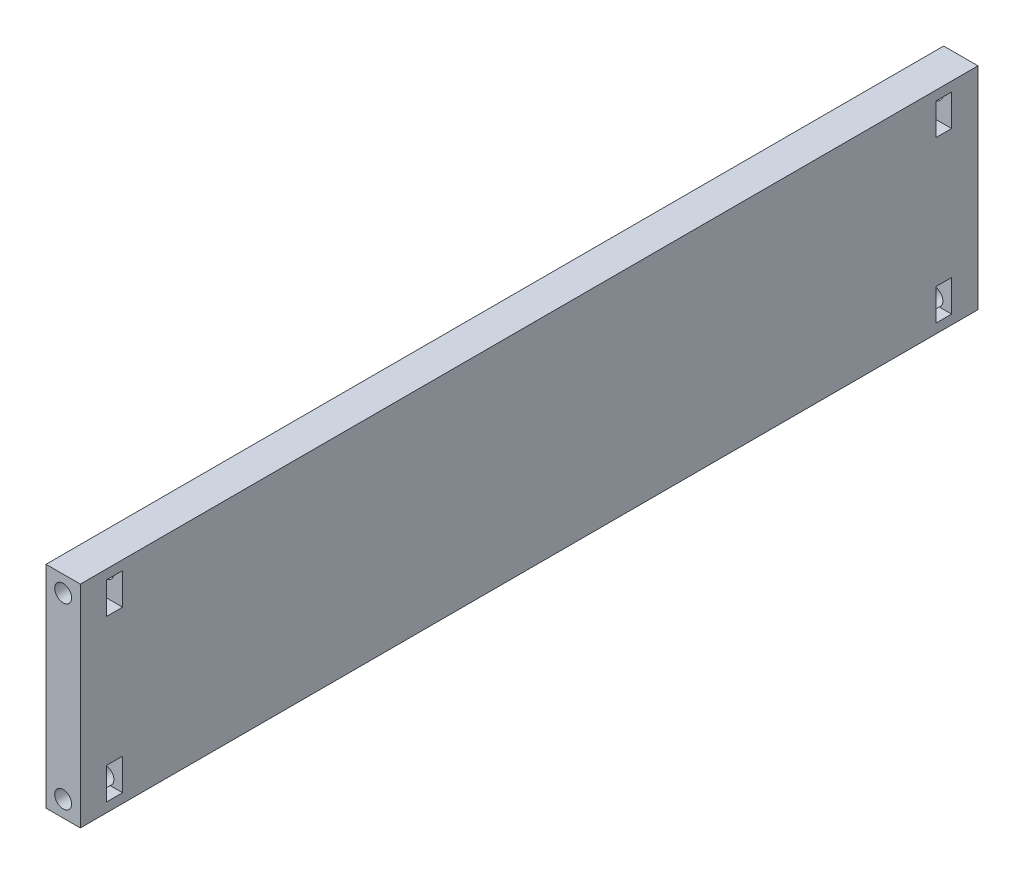
ISO-10303-21;
HEADER;
FILE_DESCRIPTION(('STEP AP214'),'2;1');
FILE_NAME('part.step','',(''),(''),'','','');
FILE_SCHEMA(('AUTOMOTIVE_DESIGN { 1 0 10303 214 1 1 1 1 }'));
ENDSEC;
DATA;
#1=APPLICATION_CONTEXT('core data for automotive mechanical design processes');
#2=APPLICATION_PROTOCOL_DEFINITION('international standard','automotive_design',2000,#1);
#3=PRODUCT_CONTEXT('',#1,'mechanical');
#4=PRODUCT('Part','Part','',(#3));
#5=PRODUCT_RELATED_PRODUCT_CATEGORY('part','',(#4));
#6=PRODUCT_DEFINITION_FORMATION('','',#4);
#7=PRODUCT_DEFINITION_CONTEXT('part definition',#1,'design');
#8=PRODUCT_DEFINITION('design','',#6,#7);
#9=PRODUCT_DEFINITION_SHAPE('','',#8);
#10=(LENGTH_UNIT() NAMED_UNIT(*) SI_UNIT(.MILLI.,.METRE.));
#11=(NAMED_UNIT(*) PLANE_ANGLE_UNIT() SI_UNIT($,.RADIAN.));
#12=(NAMED_UNIT(*) SI_UNIT($,.STERADIAN.) SOLID_ANGLE_UNIT());
#13=UNCERTAINTY_MEASURE_WITH_UNIT(LENGTH_MEASURE(1.E-05),#10,'distance_accuracy_value','');
#14=(GEOMETRIC_REPRESENTATION_CONTEXT(3) GLOBAL_UNCERTAINTY_ASSIGNED_CONTEXT((#13)) GLOBAL_UNIT_ASSIGNED_CONTEXT((#10,
#11,#12)) REPRESENTATION_CONTEXT('',''));
#15=CARTESIAN_POINT('',(0.,0.,0.));
#16=DIRECTION('',(0.,0.,1.));
#17=DIRECTION('',(1.,0.,0.));
#18=AXIS2_PLACEMENT_3D('',#15,#16,#17);
#19=CARTESIAN_POINT('',(6.5,1.78605941041524,-165.));
#20=DIRECTION('',(0.,1.,0.));
#21=DIRECTION('',(0.,0.,1.));
#22=AXIS2_PLACEMENT_3D('',#19,#20,#21);
#23=PLANE('',#22);
#24=DIRECTION('',(0.,0.,-1.));
#25=VECTOR('',#24,1.);
#26=CARTESIAN_POINT('',(4.16299514075464,1.78605941041524,-145.));
#27=LINE('',#26,#25);
#28=CARTESIAN_POINT('',(4.16299514075464,1.78605941041524,-162.));
#29=VERTEX_POINT('',#28);
#30=CARTESIAN_POINT('',(4.16299514075464,1.78605941041524,-165.));
#31=VERTEX_POINT('',#30);
#32=EDGE_CURVE('E447',#29,#31,#27,.T.);
#33=ORIENTED_EDGE('',*,*,#32,.F.);
#34=DIRECTION('',(-1.,0.,0.));
#35=VECTOR('',#34,1.);
#36=CARTESIAN_POINT('',(6.5,1.78605941041524,-162.));
#37=LINE('',#36,#35);
#38=CARTESIAN_POINT('',(6.5,1.78605941041524,-162.));
#39=VERTEX_POINT('',#38);
#40=EDGE_CURVE('E305',#39,#29,#37,.T.);
#41=ORIENTED_EDGE('',*,*,#40,.F.);
#42=DIRECTION('',(0.,0.,-1.));
#43=VECTOR('',#42,1.);
#44=CARTESIAN_POINT('',(6.5,1.78605941041524,-165.));
#45=LINE('',#44,#43);
#46=CARTESIAN_POINT('',(6.5,1.78605941041524,-165.));
#47=VERTEX_POINT('',#46);
#48=EDGE_CURVE('E284',#39,#47,#45,.T.);
#49=ORIENTED_EDGE('',*,*,#48,.T.);
#50=DIRECTION('',(-1.,0.,0.));
#51=VECTOR('',#50,1.);
#52=CARTESIAN_POINT('',(6.5,1.78605941041524,-165.));
#53=LINE('',#52,#51);
#54=EDGE_CURVE('E313',#47,#31,#53,.T.);
#55=ORIENTED_EDGE('',*,*,#54,.T.);
#56=EDGE_LOOP('',(#33,#41,#49,#55));
#57=FACE_BOUND('',#56,.T.);
#58=ADVANCED_FACE('F36',(#57),#23,.T.);
#59=CARTESIAN_POINT('',(6.5,38.2139405895848,-165.));
#60=DIRECTION('',(0.,-1.,0.));
#61=DIRECTION('',(0.,0.,-1.));
#62=AXIS2_PLACEMENT_3D('',#59,#60,#61);
#63=PLANE('',#62);
#64=DIRECTION('',(0.,0.,-1.));
#65=VECTOR('',#64,1.);
#66=CARTESIAN_POINT('',(2.33700485924531,38.2139405895848,-145.));
#67=LINE('',#66,#65);
#68=CARTESIAN_POINT('',(2.33700485924531,38.2139405895848,-162.));
#69=VERTEX_POINT('',#68);
#70=CARTESIAN_POINT('',(2.33700485924531,38.2139405895848,-165.));
#71=VERTEX_POINT('',#70);
#72=EDGE_CURVE('E220',#69,#71,#67,.T.);
#73=ORIENTED_EDGE('',*,*,#72,.F.);
#74=DIRECTION('',(-1.,0.,0.));
#75=VECTOR('',#74,1.);
#76=CARTESIAN_POINT('',(6.5,38.2139405895848,-162.));
#77=LINE('',#76,#75);
#78=CARTESIAN_POINT('',(0.,38.2139405895848,-162.));
#79=VERTEX_POINT('',#78);
#80=EDGE_CURVE('E231',#69,#79,#77,.T.);
#81=ORIENTED_EDGE('',*,*,#80,.T.);
#82=DIRECTION('',(0.,0.,1.));
#83=VECTOR('',#82,1.);
#84=CARTESIAN_POINT('',(0.,38.2139405895848,-165.));
#85=LINE('',#84,#83);
#86=CARTESIAN_POINT('',(0.,38.2139405895848,-165.));
#87=VERTEX_POINT('',#86);
#88=EDGE_CURVE('E429',#87,#79,#85,.T.);
#89=ORIENTED_EDGE('',*,*,#88,.F.);
#90=DIRECTION('',(-1.,0.,0.));
#91=VECTOR('',#90,1.);
#92=CARTESIAN_POINT('',(6.5,38.2139405895848,-165.));
#93=LINE('',#92,#91);
#94=EDGE_CURVE('E233',#71,#87,#93,.T.);
#95=ORIENTED_EDGE('',*,*,#94,.F.);
#96=EDGE_LOOP('',(#73,#81,#89,#95));
#97=FACE_BOUND('',#96,.T.);
#98=ADVANCED_FACE('F229',(#97),#63,.T.);
#99=CARTESIAN_POINT('',(6.5,38.2139405895848,-5.));
#100=DIRECTION('',(0.,-1.,0.));
#101=DIRECTION('',(0.,0.,-1.));
#102=AXIS2_PLACEMENT_3D('',#99,#100,#101);
#103=PLANE('',#102);
#104=DIRECTION('',(0.,0.,1.));
#105=VECTOR('',#104,1.);
#106=CARTESIAN_POINT('',(4.1629951407547,38.2139405895848,-25.));
#107=LINE('',#106,#105);
#108=CARTESIAN_POINT('',(4.1629951407547,38.2139405895848,-8.));
#109=VERTEX_POINT('',#108);
#110=CARTESIAN_POINT('',(4.1629951407547,38.2139405895848,-5.));
#111=VERTEX_POINT('',#110);
#112=EDGE_CURVE('E353',#109,#111,#107,.T.);
#113=ORIENTED_EDGE('',*,*,#112,.F.);
#114=DIRECTION('',(-1.,0.,0.));
#115=VECTOR('',#114,1.);
#116=CARTESIAN_POINT('',(6.5,38.2139405895848,-8.));
#117=LINE('',#116,#115);
#118=CARTESIAN_POINT('',(6.5,38.2139405895848,-8.));
#119=VERTEX_POINT('',#118);
#120=EDGE_CURVE('E272',#119,#109,#117,.T.);
#121=ORIENTED_EDGE('',*,*,#120,.F.);
#122=DIRECTION('',(0.,0.,1.));
#123=VECTOR('',#122,1.);
#124=CARTESIAN_POINT('',(6.5,38.2139405895848,-5.));
#125=LINE('',#124,#123);
#126=CARTESIAN_POINT('',(6.5,38.2139405895848,-5.));
#127=VERTEX_POINT('',#126);
#128=EDGE_CURVE('E251',#119,#127,#125,.T.);
#129=ORIENTED_EDGE('',*,*,#128,.T.);
#130=DIRECTION('',(-1.,0.,0.));
#131=VECTOR('',#130,1.);
#132=CARTESIAN_POINT('',(6.5,38.2139405895848,-5.));
#133=LINE('',#132,#131);
#134=EDGE_CURVE('E280',#127,#111,#133,.T.);
#135=ORIENTED_EDGE('',*,*,#134,.T.);
#136=EDGE_LOOP('',(#113,#121,#129,#135));
#137=FACE_BOUND('',#136,.T.);
#138=ADVANCED_FACE('F361',(#137),#103,.T.);
#139=CARTESIAN_POINT('',(6.5,1.78605941041524,-5.));
#140=DIRECTION('',(0.,1.,0.));
#141=DIRECTION('',(0.,0.,1.));
#142=AXIS2_PLACEMENT_3D('',#139,#140,#141);
#143=PLANE('',#142);
#144=DIRECTION('',(0.,0.,1.));
#145=VECTOR('',#144,1.);
#146=CARTESIAN_POINT('',(2.33700485924536,1.78605941041524,-25.));
#147=LINE('',#146,#145);
#148=CARTESIAN_POINT('',(2.33700485924536,1.78605941041524,-8.));
#149=VERTEX_POINT('',#148);
#150=CARTESIAN_POINT('',(2.33700485924536,1.78605941041524,-5.));
#151=VERTEX_POINT('',#150);
#152=EDGE_CURVE('E468',#149,#151,#147,.T.);
#153=ORIENTED_EDGE('',*,*,#152,.F.);
#154=DIRECTION('',(-1.,0.,0.));
#155=VECTOR('',#154,1.);
#156=CARTESIAN_POINT('',(6.5,1.78605941041524,-8.));
#157=LINE('',#156,#155);
#158=CARTESIAN_POINT('',(0.,1.78605941041524,-8.));
#159=VERTEX_POINT('',#158);
#160=EDGE_CURVE('E408',#149,#159,#157,.T.);
#161=ORIENTED_EDGE('',*,*,#160,.T.);
#162=DIRECTION('',(0.,0.,-1.));
#163=VECTOR('',#162,1.);
#164=CARTESIAN_POINT('',(0.,1.78605941041524,-5.));
#165=LINE('',#164,#163);
#166=CARTESIAN_POINT('',(0.,1.78605941041524,-5.));
#167=VERTEX_POINT('',#166);
#168=EDGE_CURVE('E382',#167,#159,#165,.T.);
#169=ORIENTED_EDGE('',*,*,#168,.F.);
#170=DIRECTION('',(-1.,0.,0.));
#171=VECTOR('',#170,1.);
#172=CARTESIAN_POINT('',(6.5,1.78605941041524,-5.));
#173=LINE('',#172,#171);
#174=EDGE_CURVE('E412',#151,#167,#173,.T.);
#175=ORIENTED_EDGE('',*,*,#174,.F.);
#176=EDGE_LOOP('',(#153,#161,#169,#175));
#177=FACE_BOUND('',#176,.T.);
#178=ADVANCED_FACE('F495',(#177),#143,.T.);
#179=CARTESIAN_POINT('',(6.5,0.,0.));
#180=DIRECTION('',(-1.,0.,0.));
#181=DIRECTION('',(0.,0.,1.));
#182=AXIS2_PLACEMENT_3D('',#179,#180,#181);
#183=PLANE('',#182);
#184=DIRECTION('',(0.,1.,0.));
#185=VECTOR('',#184,1.);
#186=CARTESIAN_POINT('',(6.5,38.2139405895848,-165.));
#187=LINE('',#186,#185);
#188=CARTESIAN_POINT('',(6.5,32.2139405895848,-165.));
#189=VERTEX_POINT('',#188);
#190=CARTESIAN_POINT('',(6.5,38.2139405895848,-165.));
#191=VERTEX_POINT('',#190);
#192=EDGE_CURVE('E417',#189,#191,#187,.T.);
#193=ORIENTED_EDGE('',*,*,#192,.F.);
#194=DIRECTION('',(0.,0.,-1.));
#195=VECTOR('',#194,1.);
#196=CARTESIAN_POINT('',(6.5,32.2139405895848,-165.));
#197=LINE('',#196,#195);
#198=CARTESIAN_POINT('',(6.5,32.2139405895848,-162.));
#199=VERTEX_POINT('',#198);
#200=EDGE_CURVE('E425',#199,#189,#197,.T.);
#201=ORIENTED_EDGE('',*,*,#200,.F.);
#202=DIRECTION('',(0.,-1.,0.));
#203=VECTOR('',#202,1.);
#204=CARTESIAN_POINT('',(6.5,38.2139405895848,-162.));
#205=LINE('',#204,#203);
#206=CARTESIAN_POINT('',(6.5,38.2139405895848,-162.));
#207=VERTEX_POINT('',#206);
#208=EDGE_CURVE('E422',#207,#199,#205,.T.);
#209=ORIENTED_EDGE('',*,*,#208,.F.);
#210=DIRECTION('',(0.,0.,1.));
#211=VECTOR('',#210,1.);
#212=CARTESIAN_POINT('',(6.5,38.2139405895848,-165.));
#213=LINE('',#212,#211);
#214=EDGE_CURVE('E419',#191,#207,#213,.T.);
#215=ORIENTED_EDGE('',*,*,#214,.F.);
#216=EDGE_LOOP('',(#193,#201,#209,#215));
#217=FACE_BOUND('',#216,.T.);
#218=ORIENTED_EDGE('',*,*,#48,.F.);
#219=DIRECTION('',(0.,-1.,0.));
#220=VECTOR('',#219,1.);
#221=CARTESIAN_POINT('',(6.5,1.78605941041524,-162.));
#222=LINE('',#221,#220);
#223=CARTESIAN_POINT('',(6.5,7.78605941041523,-162.));
#224=VERTEX_POINT('',#223);
#225=EDGE_CURVE('E292',#224,#39,#222,.T.);
#226=ORIENTED_EDGE('',*,*,#225,.F.);
#227=DIRECTION('',(0.,0.,1.));
#228=VECTOR('',#227,1.);
#229=CARTESIAN_POINT('',(6.5,7.78605941041523,-165.));
#230=LINE('',#229,#228);
#231=CARTESIAN_POINT('',(6.5,7.78605941041523,-165.));
#232=VERTEX_POINT('',#231);
#233=EDGE_CURVE('E289',#232,#224,#230,.T.);
#234=ORIENTED_EDGE('',*,*,#233,.F.);
#235=DIRECTION('',(0.,1.,0.));
#236=VECTOR('',#235,1.);
#237=CARTESIAN_POINT('',(6.5,1.78605941041524,-165.));
#238=LINE('',#237,#236);
#239=EDGE_CURVE('E286',#47,#232,#238,.T.);
#240=ORIENTED_EDGE('',*,*,#239,.F.);
#241=EDGE_LOOP('',(#218,#226,#234,#240));
#242=FACE_BOUND('',#241,.T.);
#243=DIRECTION('',(0.,-1.,0.));
#244=VECTOR('',#243,1.);
#245=CARTESIAN_POINT('',(6.5,0.,0.));
#246=LINE('',#245,#244);
#247=CARTESIAN_POINT('',(6.5,40.,0.));
#248=VERTEX_POINT('',#247);
#249=CARTESIAN_POINT('',(6.5,0.,0.));
#250=VERTEX_POINT('',#249);
#251=EDGE_CURVE('E317',#248,#250,#246,.T.);
#252=ORIENTED_EDGE('',*,*,#251,.T.);
#253=DIRECTION('',(0.,0.,-1.));
#254=VECTOR('',#253,1.);
#255=CARTESIAN_POINT('',(6.5,0.,0.));
#256=LINE('',#255,#254);
#257=CARTESIAN_POINT('',(6.5,0.,-170.));
#258=VERTEX_POINT('',#257);
#259=EDGE_CURVE('E320',#250,#258,#256,.T.);
#260=ORIENTED_EDGE('',*,*,#259,.T.);
#261=DIRECTION('',(0.,1.,0.));
#262=VECTOR('',#261,1.);
#263=CARTESIAN_POINT('',(6.5,0.,-170.));
#264=LINE('',#263,#262);
#265=CARTESIAN_POINT('',(6.5,40.,-170.));
#266=VERTEX_POINT('',#265);
#267=EDGE_CURVE('E323',#258,#266,#264,.T.);
#268=ORIENTED_EDGE('',*,*,#267,.T.);
#269=DIRECTION('',(0.,0.,1.));
#270=VECTOR('',#269,1.);
#271=CARTESIAN_POINT('',(6.5,40.,0.));
#272=LINE('',#271,#270);
#273=EDGE_CURVE('E325',#266,#248,#272,.T.);
#274=ORIENTED_EDGE('',*,*,#273,.T.);
#275=EDGE_LOOP('',(#252,#260,#268,#274));
#276=FACE_BOUND('',#275,.T.);
#277=ORIENTED_EDGE('',*,*,#128,.F.);
#278=DIRECTION('',(0.,1.,0.));
#279=VECTOR('',#278,1.);
#280=CARTESIAN_POINT('',(6.5,38.2139405895848,-8.));
#281=LINE('',#280,#279);
#282=CARTESIAN_POINT('',(6.5,32.2139405895848,-8.));
#283=VERTEX_POINT('',#282);
#284=EDGE_CURVE('E259',#283,#119,#281,.T.);
#285=ORIENTED_EDGE('',*,*,#284,.F.);
#286=DIRECTION('',(0.,0.,-1.));
#287=VECTOR('',#286,1.);
#288=CARTESIAN_POINT('',(6.5,32.2139405895848,-5.));
#289=LINE('',#288,#287);
#290=CARTESIAN_POINT('',(6.5,32.2139405895848,-5.));
#291=VERTEX_POINT('',#290);
#292=EDGE_CURVE('E256',#291,#283,#289,.T.);
#293=ORIENTED_EDGE('',*,*,#292,.F.);
#294=DIRECTION('',(0.,-1.,0.));
#295=VECTOR('',#294,1.);
#296=CARTESIAN_POINT('',(6.5,38.2139405895848,-5.));
#297=LINE('',#296,#295);
#298=EDGE_CURVE('E253',#127,#291,#297,.T.);
#299=ORIENTED_EDGE('',*,*,#298,.F.);
#300=EDGE_LOOP('',(#277,#285,#293,#299));
#301=FACE_BOUND('',#300,.T.);
#302=DIRECTION('',(0.,-1.,0.));
#303=VECTOR('',#302,1.);
#304=CARTESIAN_POINT('',(6.5,1.78605941041524,-5.));
#305=LINE('',#304,#303);
#306=CARTESIAN_POINT('',(6.5,7.78605941041523,-5.));
#307=VERTEX_POINT('',#306);
#308=CARTESIAN_POINT('',(6.5,1.78605941041524,-5.));
#309=VERTEX_POINT('',#308);
#310=EDGE_CURVE('E386',#307,#309,#305,.T.);
#311=ORIENTED_EDGE('',*,*,#310,.F.);
#312=DIRECTION('',(0.,0.,1.));
#313=VECTOR('',#312,1.);
#314=CARTESIAN_POINT('',(6.5,7.78605941041523,-5.));
#315=LINE('',#314,#313);
#316=CARTESIAN_POINT('',(6.5,7.78605941041523,-8.));
#317=VERTEX_POINT('',#316);
#318=EDGE_CURVE('E394',#317,#307,#315,.T.);
#319=ORIENTED_EDGE('',*,*,#318,.F.);
#320=DIRECTION('',(0.,1.,0.));
#321=VECTOR('',#320,1.);
#322=CARTESIAN_POINT('',(6.5,1.78605941041524,-8.));
#323=LINE('',#322,#321);
#324=CARTESIAN_POINT('',(6.5,1.78605941041524,-8.));
#325=VERTEX_POINT('',#324);
#326=EDGE_CURVE('E391',#325,#317,#323,.T.);
#327=ORIENTED_EDGE('',*,*,#326,.F.);
#328=DIRECTION('',(0.,0.,-1.));
#329=VECTOR('',#328,1.);
#330=CARTESIAN_POINT('',(6.5,1.78605941041524,-5.));
#331=LINE('',#330,#329);
#332=EDGE_CURVE('E388',#309,#325,#331,.T.);
#333=ORIENTED_EDGE('',*,*,#332,.F.);
#334=EDGE_LOOP('',(#311,#319,#327,#333));
#335=FACE_BOUND('',#334,.T.);
#336=ADVANCED_FACE('F371',(#217,#242,#276,#301,#335),#183,.F.);
#337=CARTESIAN_POINT('',(0.,0.,0.));
#338=DIRECTION('',(-1.,0.,0.));
#339=DIRECTION('',(0.,0.,1.));
#340=AXIS2_PLACEMENT_3D('',#337,#338,#339);
#341=PLANE('',#340);
#342=DIRECTION('',(0.,-1.,0.));
#343=VECTOR('',#342,1.);
#344=CARTESIAN_POINT('',(0.,0.,0.));
#345=LINE('',#344,#343);
#346=CARTESIAN_POINT('',(0.,40.,0.));
#347=VERTEX_POINT('',#346);
#348=CARTESIAN_POINT('',(0.,0.,0.));
#349=VERTEX_POINT('',#348);
#350=EDGE_CURVE('E316',#347,#349,#345,.T.);
#351=ORIENTED_EDGE('',*,*,#350,.F.);
#352=DIRECTION('',(0.,0.,1.));
#353=VECTOR('',#352,1.);
#354=CARTESIAN_POINT('',(0.,40.,0.));
#355=LINE('',#354,#353);
#356=CARTESIAN_POINT('',(0.,40.,-170.));
#357=VERTEX_POINT('',#356);
#358=EDGE_CURVE('E321',#357,#347,#355,.T.);
#359=ORIENTED_EDGE('',*,*,#358,.F.);
#360=DIRECTION('',(0.,1.,0.));
#361=VECTOR('',#360,1.);
#362=CARTESIAN_POINT('',(0.,0.,-170.));
#363=LINE('',#362,#361);
#364=CARTESIAN_POINT('',(0.,0.,-170.));
#365=VERTEX_POINT('',#364);
#366=EDGE_CURVE('E332',#365,#357,#363,.T.);
#367=ORIENTED_EDGE('',*,*,#366,.F.);
#368=DIRECTION('',(0.,0.,-1.));
#369=VECTOR('',#368,1.);
#370=CARTESIAN_POINT('',(0.,0.,0.));
#371=LINE('',#370,#369);
#372=EDGE_CURVE('E330',#349,#365,#371,.T.);
#373=ORIENTED_EDGE('',*,*,#372,.F.);
#374=EDGE_LOOP('',(#351,#359,#367,#373));
#375=FACE_BOUND('',#374,.T.);
#376=DIRECTION('',(0.,-1.,0.));
#377=VECTOR('',#376,1.);
#378=CARTESIAN_POINT('',(0.,1.78605941041524,-162.));
#379=LINE('',#378,#377);
#380=CARTESIAN_POINT('',(0.,7.78605941041523,-162.));
#381=VERTEX_POINT('',#380);
#382=CARTESIAN_POINT('',(0.,1.78605941041524,-162.));
#383=VERTEX_POINT('',#382);
#384=EDGE_CURVE('E287',#381,#383,#379,.T.);
#385=ORIENTED_EDGE('',*,*,#384,.T.);
#386=DIRECTION('',(0.,0.,-1.));
#387=VECTOR('',#386,1.);
#388=CARTESIAN_POINT('',(0.,1.78605941041524,-165.));
#389=LINE('',#388,#387);
#390=CARTESIAN_POINT('',(0.,1.78605941041524,-165.));
#391=VERTEX_POINT('',#390);
#392=EDGE_CURVE('E283',#383,#391,#389,.T.);
#393=ORIENTED_EDGE('',*,*,#392,.T.);
#394=DIRECTION('',(0.,1.,0.));
#395=VECTOR('',#394,1.);
#396=CARTESIAN_POINT('',(0.,1.78605941041524,-165.));
#397=LINE('',#396,#395);
#398=CARTESIAN_POINT('',(0.,7.78605941041523,-165.));
#399=VERTEX_POINT('',#398);
#400=EDGE_CURVE('E297',#391,#399,#397,.T.);
#401=ORIENTED_EDGE('',*,*,#400,.T.);
#402=DIRECTION('',(0.,0.,1.));
#403=VECTOR('',#402,1.);
#404=CARTESIAN_POINT('',(0.,7.78605941041523,-165.));
#405=LINE('',#404,#403);
#406=EDGE_CURVE('E300',#399,#381,#405,.T.);
#407=ORIENTED_EDGE('',*,*,#406,.T.);
#408=EDGE_LOOP('',(#385,#393,#401,#407));
#409=FACE_BOUND('',#408,.T.);
#410=DIRECTION('',(0.,1.,0.));
#411=VECTOR('',#410,1.);
#412=CARTESIAN_POINT('',(0.,38.2139405895848,-8.));
#413=LINE('',#412,#411);
#414=CARTESIAN_POINT('',(0.,32.2139405895848,-8.));
#415=VERTEX_POINT('',#414);
#416=CARTESIAN_POINT('',(0.,38.2139405895848,-8.));
#417=VERTEX_POINT('',#416);
#418=EDGE_CURVE('E254',#415,#417,#413,.T.);
#419=ORIENTED_EDGE('',*,*,#418,.T.);
#420=DIRECTION('',(0.,0.,1.));
#421=VECTOR('',#420,1.);
#422=CARTESIAN_POINT('',(0.,38.2139405895848,-5.));
#423=LINE('',#422,#421);
#424=CARTESIAN_POINT('',(0.,38.2139405895848,-5.));
#425=VERTEX_POINT('',#424);
#426=EDGE_CURVE('E250',#417,#425,#423,.T.);
#427=ORIENTED_EDGE('',*,*,#426,.T.);
#428=DIRECTION('',(0.,-1.,0.));
#429=VECTOR('',#428,1.);
#430=CARTESIAN_POINT('',(0.,38.2139405895848,-5.));
#431=LINE('',#430,#429);
#432=CARTESIAN_POINT('',(0.,32.2139405895848,-5.));
#433=VERTEX_POINT('',#432);
#434=EDGE_CURVE('E264',#425,#433,#431,.T.);
#435=ORIENTED_EDGE('',*,*,#434,.T.);
#436=DIRECTION('',(0.,0.,-1.));
#437=VECTOR('',#436,1.);
#438=CARTESIAN_POINT('',(0.,32.2139405895848,-5.));
#439=LINE('',#438,#437);
#440=EDGE_CURVE('E267',#433,#415,#439,.T.);
#441=ORIENTED_EDGE('',*,*,#440,.T.);
#442=EDGE_LOOP('',(#419,#427,#435,#441));
#443=FACE_BOUND('',#442,.T.);
#444=DIRECTION('',(0.,0.,-1.));
#445=VECTOR('',#444,1.);
#446=CARTESIAN_POINT('',(0.,32.2139405895848,-165.));
#447=LINE('',#446,#445);
#448=CARTESIAN_POINT('',(0.,32.2139405895848,-162.));
#449=VERTEX_POINT('',#448);
#450=CARTESIAN_POINT('',(0.,32.2139405895848,-165.));
#451=VERTEX_POINT('',#450);
#452=EDGE_CURVE('E420',#449,#451,#447,.T.);
#453=ORIENTED_EDGE('',*,*,#452,.T.);
#454=DIRECTION('',(0.,1.,0.));
#455=VECTOR('',#454,1.);
#456=CARTESIAN_POINT('',(0.,38.2139405895848,-165.));
#457=LINE('',#456,#455);
#458=EDGE_CURVE('E416',#451,#87,#457,.T.);
#459=ORIENTED_EDGE('',*,*,#458,.T.);
#460=ORIENTED_EDGE('',*,*,#88,.T.);
#461=DIRECTION('',(0.,-1.,0.));
#462=VECTOR('',#461,1.);
#463=CARTESIAN_POINT('',(0.,38.2139405895848,-162.));
#464=LINE('',#463,#462);
#465=EDGE_CURVE('E238',#79,#449,#464,.T.);
#466=ORIENTED_EDGE('',*,*,#465,.T.);
#467=EDGE_LOOP('',(#453,#459,#460,#466));
#468=FACE_BOUND('',#467,.T.);
#469=DIRECTION('',(0.,0.,1.));
#470=VECTOR('',#469,1.);
#471=CARTESIAN_POINT('',(0.,7.78605941041523,-5.));
#472=LINE('',#471,#470);
#473=CARTESIAN_POINT('',(0.,7.78605941041523,-8.));
#474=VERTEX_POINT('',#473);
#475=CARTESIAN_POINT('',(0.,7.78605941041523,-5.));
#476=VERTEX_POINT('',#475);
#477=EDGE_CURVE('E389',#474,#476,#472,.T.);
#478=ORIENTED_EDGE('',*,*,#477,.T.);
#479=DIRECTION('',(0.,-1.,0.));
#480=VECTOR('',#479,1.);
#481=CARTESIAN_POINT('',(0.,1.78605941041524,-5.));
#482=LINE('',#481,#480);
#483=EDGE_CURVE('E379',#476,#167,#482,.T.);
#484=ORIENTED_EDGE('',*,*,#483,.T.);
#485=ORIENTED_EDGE('',*,*,#168,.T.);
#486=DIRECTION('',(0.,1.,0.));
#487=VECTOR('',#486,1.);
#488=CARTESIAN_POINT('',(0.,1.78605941041524,-8.));
#489=LINE('',#488,#487);
#490=EDGE_CURVE('E399',#159,#474,#489,.T.);
#491=ORIENTED_EDGE('',*,*,#490,.T.);
#492=EDGE_LOOP('',(#478,#484,#485,#491));
#493=FACE_BOUND('',#492,.T.);
#494=ADVANCED_FACE('F442',(#375,#409,#443,#468,#493),#341,.T.);
#495=CARTESIAN_POINT('',(6.5,0.,0.));
#496=DIRECTION('',(0.,0.,-1.));
#497=DIRECTION('',(-1.,0.,0.));
#498=AXIS2_PLACEMENT_3D('',#495,#496,#497);
#499=PLANE('',#498);
#500=CARTESIAN_POINT('',(3.25,36.9,0.));
#501=DIRECTION('',(0.,0.,1.));
#502=DIRECTION('',(1.,0.,0.));
#503=AXIS2_PLACEMENT_3D('',#500,#501,#502);
#504=CIRCLE('',#503,1.6);
#505=CARTESIAN_POINT('',(4.85,36.9,0.));
#506=VERTEX_POINT('',#505);
#507=EDGE_CURVE('E459',#506,#506,#504,.T.);
#508=ORIENTED_EDGE('',*,*,#507,.F.);
#509=EDGE_LOOP('',(#508));
#510=FACE_BOUND('',#509,.T.);
#511=CARTESIAN_POINT('',(3.25,3.10000000000002,0.));
#512=DIRECTION('',(0.,0.,1.));
#513=DIRECTION('',(1.,0.,0.));
#514=AXIS2_PLACEMENT_3D('',#511,#512,#513);
#515=CIRCLE('',#514,1.6);
#516=CARTESIAN_POINT('',(4.85,3.10000000000002,0.));
#517=VERTEX_POINT('',#516);
#518=EDGE_CURVE('E454',#517,#517,#515,.T.);
#519=ORIENTED_EDGE('',*,*,#518,.F.);
#520=EDGE_LOOP('',(#519));
#521=FACE_BOUND('',#520,.T.);
#522=ORIENTED_EDGE('',*,*,#350,.T.);
#523=DIRECTION('',(-1.,0.,0.));
#524=VECTOR('',#523,1.);
#525=CARTESIAN_POINT('',(6.5,0.,0.));
#526=LINE('',#525,#524);
#527=EDGE_CURVE('E343',#250,#349,#526,.T.);
#528=ORIENTED_EDGE('',*,*,#527,.F.);
#529=ORIENTED_EDGE('',*,*,#251,.F.);
#530=DIRECTION('',(-1.,0.,0.));
#531=VECTOR('',#530,1.);
#532=CARTESIAN_POINT('',(6.5,40.,0.));
#533=LINE('',#532,#531);
#534=EDGE_CURVE('E327',#248,#347,#533,.T.);
#535=ORIENTED_EDGE('',*,*,#534,.T.);
#536=EDGE_LOOP('',(#522,#528,#529,#535));
#537=FACE_BOUND('',#536,.T.);
#538=ADVANCED_FACE('F38',(#510,#521,#537),#499,.F.);
#539=CARTESIAN_POINT('',(6.5,0.,0.));
#540=DIRECTION('',(0.,1.,0.));
#541=DIRECTION('',(0.,0.,1.));
#542=AXIS2_PLACEMENT_3D('',#539,#540,#541);
#543=PLANE('',#542);
#544=ORIENTED_EDGE('',*,*,#372,.T.);
#545=DIRECTION('',(-1.,0.,0.));
#546=VECTOR('',#545,1.);
#547=CARTESIAN_POINT('',(6.5,0.,-170.));
#548=LINE('',#547,#546);
#549=EDGE_CURVE('E340',#258,#365,#548,.T.);
#550=ORIENTED_EDGE('',*,*,#549,.F.);
#551=ORIENTED_EDGE('',*,*,#259,.F.);
#552=ORIENTED_EDGE('',*,*,#527,.T.);
#553=EDGE_LOOP('',(#544,#550,#551,#552));
#554=FACE_BOUND('',#553,.T.);
#555=ADVANCED_FACE('F507',(#554),#543,.F.);
#556=CARTESIAN_POINT('',(6.5,0.,-170.));
#557=DIRECTION('',(0.,0.,1.));
#558=DIRECTION('',(1.,0.,0.));
#559=AXIS2_PLACEMENT_3D('',#556,#557,#558);
#560=PLANE('',#559);
#561=CARTESIAN_POINT('',(3.25,36.9,-170.));
#562=DIRECTION('',(0.,0.,-1.));
#563=DIRECTION('',(-1.,0.,0.));
#564=AXIS2_PLACEMENT_3D('',#561,#562,#563);
#565=CIRCLE('',#564,1.6);
#566=CARTESIAN_POINT('',(1.65,36.9,-170.));
#567=VERTEX_POINT('',#566);
#568=EDGE_CURVE('E622',#567,#567,#565,.T.);
#569=ORIENTED_EDGE('',*,*,#568,.F.);
#570=EDGE_LOOP('',(#569));
#571=FACE_BOUND('',#570,.T.);
#572=CARTESIAN_POINT('',(3.25,3.10000000000002,-170.));
#573=DIRECTION('',(0.,0.,-1.));
#574=DIRECTION('',(-1.,0.,0.));
#575=AXIS2_PLACEMENT_3D('',#572,#573,#574);
#576=CIRCLE('',#575,1.6);
#577=CARTESIAN_POINT('',(1.65,3.10000000000002,-170.));
#578=VERTEX_POINT('',#577);
#579=EDGE_CURVE('E630',#578,#578,#576,.T.);
#580=ORIENTED_EDGE('',*,*,#579,.F.);
#581=EDGE_LOOP('',(#580));
#582=FACE_BOUND('',#581,.T.);
#583=ORIENTED_EDGE('',*,*,#366,.T.);
#584=DIRECTION('',(-1.,0.,0.));
#585=VECTOR('',#584,1.);
#586=CARTESIAN_POINT('',(6.5,40.,-170.));
#587=LINE('',#586,#585);
#588=EDGE_CURVE('E337',#266,#357,#587,.T.);
#589=ORIENTED_EDGE('',*,*,#588,.F.);
#590=ORIENTED_EDGE('',*,*,#267,.F.);
#591=ORIENTED_EDGE('',*,*,#549,.T.);
#592=EDGE_LOOP('',(#583,#589,#590,#591));
#593=FACE_BOUND('',#592,.T.);
#594=ADVANCED_FACE('F535',(#571,#582,#593),#560,.F.);
#595=CARTESIAN_POINT('',(6.5,40.,0.));
#596=DIRECTION('',(0.,-1.,0.));
#597=DIRECTION('',(0.,0.,-1.));
#598=AXIS2_PLACEMENT_3D('',#595,#596,#597);
#599=PLANE('',#598);
#600=ORIENTED_EDGE('',*,*,#358,.T.);
#601=ORIENTED_EDGE('',*,*,#534,.F.);
#602=ORIENTED_EDGE('',*,*,#273,.F.);
#603=ORIENTED_EDGE('',*,*,#588,.T.);
#604=EDGE_LOOP('',(#600,#601,#602,#603));
#605=FACE_BOUND('',#604,.T.);
#606=ADVANCED_FACE('F527',(#605),#599,.F.);
#607=DIRECTION('',(0.,0.,-1.));
#608=VECTOR('',#607,1.);
#609=CARTESIAN_POINT('',(2.33700485924536,1.78605941041524,-145.));
#610=LINE('',#609,#608);
#611=CARTESIAN_POINT('',(2.33700485924536,1.78605941041524,-165.));
#612=VERTEX_POINT('',#611);
#613=CARTESIAN_POINT('',(2.33700485924536,1.78605941041524,-162.));
#614=VERTEX_POINT('',#613);
#615=EDGE_CURVE('E50',#612,#614,#610,.F.);
#616=ORIENTED_EDGE('',*,*,#615,.F.);
#617=EDGE_CURVE('E312',#612,#391,#53,.T.);
#618=ORIENTED_EDGE('',*,*,#617,.T.);
#619=ORIENTED_EDGE('',*,*,#392,.F.);
#620=EDGE_CURVE('E294',#614,#383,#37,.T.);
#621=ORIENTED_EDGE('',*,*,#620,.F.);
#622=EDGE_LOOP('',(#616,#618,#619,#621));
#623=FACE_BOUND('',#622,.T.);
#624=ADVANCED_FACE('F517',(#623),#23,.T.);
#625=CARTESIAN_POINT('',(6.5,1.78605941041524,-165.));
#626=DIRECTION('',(0.,0.,1.));
#627=DIRECTION('',(1.,0.,0.));
#628=AXIS2_PLACEMENT_3D('',#625,#626,#627);
#629=PLANE('',#628);
#630=CARTESIAN_POINT('',(3.25,3.10000000000002,-165.));
#631=DIRECTION('',(0.,0.,1.));
#632=DIRECTION('',(1.,0.,0.));
#633=AXIS2_PLACEMENT_3D('',#630,#631,#632);
#634=CIRCLE('',#633,1.6);
#635=EDGE_CURVE('E452',#31,#612,#634,.T.);
#636=ORIENTED_EDGE('',*,*,#635,.F.);
#637=ORIENTED_EDGE('',*,*,#54,.F.);
#638=ORIENTED_EDGE('',*,*,#239,.T.);
#639=DIRECTION('',(-1.,0.,0.));
#640=VECTOR('',#639,1.);
#641=CARTESIAN_POINT('',(6.5,7.78605941041523,-165.));
#642=LINE('',#641,#640);
#643=EDGE_CURVE('E310',#232,#399,#642,.T.);
#644=ORIENTED_EDGE('',*,*,#643,.T.);
#645=ORIENTED_EDGE('',*,*,#400,.F.);
#646=ORIENTED_EDGE('',*,*,#617,.F.);
#647=EDGE_LOOP('',(#636,#637,#638,#644,#645,#646));
#648=FACE_BOUND('',#647,.T.);
#649=ADVANCED_FACE('F526',(#648),#629,.T.);
#650=CARTESIAN_POINT('',(6.5,7.78605941041523,-165.));
#651=DIRECTION('',(0.,-1.,0.));
#652=DIRECTION('',(0.,0.,-1.));
#653=AXIS2_PLACEMENT_3D('',#650,#651,#652);
#654=PLANE('',#653);
#655=ORIENTED_EDGE('',*,*,#406,.F.);
#656=ORIENTED_EDGE('',*,*,#643,.F.);
#657=ORIENTED_EDGE('',*,*,#233,.T.);
#658=DIRECTION('',(-1.,0.,0.));
#659=VECTOR('',#658,1.);
#660=CARTESIAN_POINT('',(6.5,7.78605941041523,-162.));
#661=LINE('',#660,#659);
#662=EDGE_CURVE('E308',#224,#381,#661,.T.);
#663=ORIENTED_EDGE('',*,*,#662,.T.);
#664=EDGE_LOOP('',(#655,#656,#657,#663));
#665=FACE_BOUND('',#664,.T.);
#666=ADVANCED_FACE('F533',(#665),#654,.T.);
#667=CARTESIAN_POINT('',(6.5,1.78605941041524,-162.));
#668=DIRECTION('',(0.,0.,-1.));
#669=DIRECTION('',(-1.,0.,0.));
#670=AXIS2_PLACEMENT_3D('',#667,#668,#669);
#671=PLANE('',#670);
#672=CARTESIAN_POINT('',(3.25,3.10000000000002,-162.));
#673=DIRECTION('',(0.,0.,-1.));
#674=DIRECTION('',(-1.,0.,0.));
#675=AXIS2_PLACEMENT_3D('',#672,#673,#674);
#676=CIRCLE('',#675,1.6);
#677=EDGE_CURVE('E11',#614,#29,#676,.T.);
#678=ORIENTED_EDGE('',*,*,#677,.F.);
#679=ORIENTED_EDGE('',*,*,#620,.T.);
#680=ORIENTED_EDGE('',*,*,#384,.F.);
#681=ORIENTED_EDGE('',*,*,#662,.F.);
#682=ORIENTED_EDGE('',*,*,#225,.T.);
#683=ORIENTED_EDGE('',*,*,#40,.T.);
#684=EDGE_LOOP('',(#678,#679,#680,#681,#682,#683));
#685=FACE_BOUND('',#684,.T.);
#686=ADVANCED_FACE('F548',(#685),#671,.T.);
#687=DIRECTION('',(0.,0.,1.));
#688=VECTOR('',#687,1.);
#689=CARTESIAN_POINT('',(2.33700485924531,38.2139405895848,-25.));
#690=LINE('',#689,#688);
#691=CARTESIAN_POINT('',(2.33700485924531,38.2139405895848,-5.));
#692=VERTEX_POINT('',#691);
#693=CARTESIAN_POINT('',(2.33700485924531,38.2139405895848,-8.));
#694=VERTEX_POINT('',#693);
#695=EDGE_CURVE('E356',#692,#694,#690,.F.);
#696=ORIENTED_EDGE('',*,*,#695,.F.);
#697=EDGE_CURVE('E279',#692,#425,#133,.T.);
#698=ORIENTED_EDGE('',*,*,#697,.T.);
#699=ORIENTED_EDGE('',*,*,#426,.F.);
#700=EDGE_CURVE('E261',#694,#417,#117,.T.);
#701=ORIENTED_EDGE('',*,*,#700,.F.);
#702=EDGE_LOOP('',(#696,#698,#699,#701));
#703=FACE_BOUND('',#702,.T.);
#704=ADVANCED_FACE('F564',(#703),#103,.T.);
#705=CARTESIAN_POINT('',(6.5,38.2139405895848,-5.));
#706=DIRECTION('',(0.,0.,-1.));
#707=DIRECTION('',(0.,1.,0.));
#708=AXIS2_PLACEMENT_3D('',#705,#706,#707);
#709=PLANE('',#708);
#710=CARTESIAN_POINT('',(3.25,36.9,-5.));
#711=DIRECTION('',(0.,0.,-1.));
#712=DIRECTION('',(0.,1.,0.));
#713=AXIS2_PLACEMENT_3D('',#710,#711,#712);
#714=CIRCLE('',#713,1.6);
#715=EDGE_CURVE('E364',#111,#692,#714,.T.);
#716=ORIENTED_EDGE('',*,*,#715,.F.);
#717=ORIENTED_EDGE('',*,*,#134,.F.);
#718=ORIENTED_EDGE('',*,*,#298,.T.);
#719=DIRECTION('',(-1.,0.,0.));
#720=VECTOR('',#719,1.);
#721=CARTESIAN_POINT('',(6.5,32.2139405895848,-5.));
#722=LINE('',#721,#720);
#723=EDGE_CURVE('E277',#291,#433,#722,.T.);
#724=ORIENTED_EDGE('',*,*,#723,.T.);
#725=ORIENTED_EDGE('',*,*,#434,.F.);
#726=ORIENTED_EDGE('',*,*,#697,.F.);
#727=EDGE_LOOP('',(#716,#717,#718,#724,#725,#726));
#728=FACE_BOUND('',#727,.T.);
#729=ADVANCED_FACE('F375',(#728),#709,.T.);
#730=CARTESIAN_POINT('',(6.5,32.2139405895848,-5.));
#731=DIRECTION('',(0.,1.,0.));
#732=DIRECTION('',(0.,0.,1.));
#733=AXIS2_PLACEMENT_3D('',#730,#731,#732);
#734=PLANE('',#733);
#735=ORIENTED_EDGE('',*,*,#440,.F.);
#736=ORIENTED_EDGE('',*,*,#723,.F.);
#737=ORIENTED_EDGE('',*,*,#292,.T.);
#738=DIRECTION('',(-1.,0.,0.));
#739=VECTOR('',#738,1.);
#740=CARTESIAN_POINT('',(6.5,32.2139405895848,-8.));
#741=LINE('',#740,#739);
#742=EDGE_CURVE('E275',#283,#415,#741,.T.);
#743=ORIENTED_EDGE('',*,*,#742,.T.);
#744=EDGE_LOOP('',(#735,#736,#737,#743));
#745=FACE_BOUND('',#744,.T.);
#746=ADVANCED_FACE('F572',(#745),#734,.T.);
#747=CARTESIAN_POINT('',(6.5,38.2139405895848,-8.));
#748=DIRECTION('',(0.,0.,1.));
#749=DIRECTION('',(1.,0.,0.));
#750=AXIS2_PLACEMENT_3D('',#747,#748,#749);
#751=PLANE('',#750);
#752=CARTESIAN_POINT('',(3.25,36.9,-8.));
#753=DIRECTION('',(0.,0.,1.));
#754=DIRECTION('',(1.,0.,0.));
#755=AXIS2_PLACEMENT_3D('',#752,#753,#754);
#756=CIRCLE('',#755,1.6);
#757=EDGE_CURVE('E226',#694,#109,#756,.T.);
#758=ORIENTED_EDGE('',*,*,#757,.F.);
#759=ORIENTED_EDGE('',*,*,#700,.T.);
#760=ORIENTED_EDGE('',*,*,#418,.F.);
#761=ORIENTED_EDGE('',*,*,#742,.F.);
#762=ORIENTED_EDGE('',*,*,#284,.T.);
#763=ORIENTED_EDGE('',*,*,#120,.T.);
#764=EDGE_LOOP('',(#758,#759,#760,#761,#762,#763));
#765=FACE_BOUND('',#764,.T.);
#766=ADVANCED_FACE('F366',(#765),#751,.T.);
#767=CARTESIAN_POINT('',(6.5,38.2139405895848,-165.));
#768=DIRECTION('',(0.,0.,1.));
#769=DIRECTION('',(1.,0.,0.));
#770=AXIS2_PLACEMENT_3D('',#767,#768,#769);
#771=PLANE('',#770);
#772=CARTESIAN_POINT('',(3.25,36.9,-165.));
#773=DIRECTION('',(0.,0.,1.));
#774=DIRECTION('',(1.,0.,0.));
#775=AXIS2_PLACEMENT_3D('',#772,#773,#774);
#776=CIRCLE('',#775,1.6);
#777=CARTESIAN_POINT('',(4.16299514075469,38.2139405895848,-165.));
#778=VERTEX_POINT('',#777);
#779=EDGE_CURVE('E234',#71,#778,#776,.T.);
#780=ORIENTED_EDGE('',*,*,#779,.F.);
#781=ORIENTED_EDGE('',*,*,#94,.T.);
#782=ORIENTED_EDGE('',*,*,#458,.F.);
#783=DIRECTION('',(-1.,0.,0.));
#784=VECTOR('',#783,1.);
#785=CARTESIAN_POINT('',(6.5,32.2139405895848,-165.));
#786=LINE('',#785,#784);
#787=EDGE_CURVE('E243',#189,#451,#786,.T.);
#788=ORIENTED_EDGE('',*,*,#787,.F.);
#789=ORIENTED_EDGE('',*,*,#192,.T.);
#790=EDGE_CURVE('E247',#191,#778,#93,.T.);
#791=ORIENTED_EDGE('',*,*,#790,.T.);
#792=EDGE_LOOP('',(#780,#781,#782,#788,#789,#791));
#793=FACE_BOUND('',#792,.T.);
#794=ADVANCED_FACE('F444',(#793),#771,.T.);
#795=DIRECTION('',(0.,0.,-1.));
#796=VECTOR('',#795,1.);
#797=CARTESIAN_POINT('',(4.16299514075469,38.2139405895848,-145.));
#798=LINE('',#797,#796);
#799=CARTESIAN_POINT('',(4.16299514075469,38.2139405895848,-162.));
#800=VERTEX_POINT('',#799);
#801=EDGE_CURVE('E58',#778,#800,#798,.F.);
#802=ORIENTED_EDGE('',*,*,#801,.F.);
#803=ORIENTED_EDGE('',*,*,#790,.F.);
#804=ORIENTED_EDGE('',*,*,#214,.T.);
#805=EDGE_CURVE('E240',#207,#800,#77,.T.);
#806=ORIENTED_EDGE('',*,*,#805,.T.);
#807=EDGE_LOOP('',(#802,#803,#804,#806));
#808=FACE_BOUND('',#807,.T.);
#809=ADVANCED_FACE('F522',(#808),#63,.T.);
#810=CARTESIAN_POINT('',(6.5,38.2139405895848,-162.));
#811=DIRECTION('',(0.,0.,-1.));
#812=DIRECTION('',(-1.,0.,0.));
#813=AXIS2_PLACEMENT_3D('',#810,#811,#812);
#814=PLANE('',#813);
#815=CARTESIAN_POINT('',(3.25,36.9,-162.));
#816=DIRECTION('',(0.,0.,-1.));
#817=DIRECTION('',(-1.,0.,0.));
#818=AXIS2_PLACEMENT_3D('',#815,#816,#817);
#819=CIRCLE('',#818,1.6);
#820=EDGE_CURVE('E44',#800,#69,#819,.T.);
#821=ORIENTED_EDGE('',*,*,#820,.F.);
#822=ORIENTED_EDGE('',*,*,#805,.F.);
#823=ORIENTED_EDGE('',*,*,#208,.T.);
#824=DIRECTION('',(-1.,0.,0.));
#825=VECTOR('',#824,1.);
#826=CARTESIAN_POINT('',(6.5,32.2139405895848,-162.));
#827=LINE('',#826,#825);
#828=EDGE_CURVE('E241',#199,#449,#827,.T.);
#829=ORIENTED_EDGE('',*,*,#828,.T.);
#830=ORIENTED_EDGE('',*,*,#465,.F.);
#831=ORIENTED_EDGE('',*,*,#80,.F.);
#832=EDGE_LOOP('',(#821,#822,#823,#829,#830,#831));
#833=FACE_BOUND('',#832,.T.);
#834=ADVANCED_FACE('F236',(#833),#814,.T.);
#835=CARTESIAN_POINT('',(6.5,32.2139405895848,-165.));
#836=DIRECTION('',(0.,1.,0.));
#837=DIRECTION('',(0.,0.,1.));
#838=AXIS2_PLACEMENT_3D('',#835,#836,#837);
#839=PLANE('',#838);
#840=ORIENTED_EDGE('',*,*,#452,.F.);
#841=ORIENTED_EDGE('',*,*,#828,.F.);
#842=ORIENTED_EDGE('',*,*,#200,.T.);
#843=ORIENTED_EDGE('',*,*,#787,.T.);
#844=EDGE_LOOP('',(#840,#841,#842,#843));
#845=FACE_BOUND('',#844,.T.);
#846=ADVANCED_FACE('F437',(#845),#839,.T.);
#847=CARTESIAN_POINT('',(6.5,1.78605941041524,-5.));
#848=DIRECTION('',(0.,0.,-1.));
#849=DIRECTION('',(0.,1.,0.));
#850=AXIS2_PLACEMENT_3D('',#847,#848,#849);
#851=PLANE('',#850);
#852=CARTESIAN_POINT('',(3.25,3.10000000000002,-5.));
#853=DIRECTION('',(0.,0.,-1.));
#854=DIRECTION('',(0.,1.,0.));
#855=AXIS2_PLACEMENT_3D('',#852,#853,#854);
#856=CIRCLE('',#855,1.6);
#857=CARTESIAN_POINT('',(4.16299514075464,1.78605941041524,-5.));
#858=VERTEX_POINT('',#857);
#859=EDGE_CURVE('E470',#151,#858,#856,.T.);
#860=ORIENTED_EDGE('',*,*,#859,.F.);
#861=ORIENTED_EDGE('',*,*,#174,.T.);
#862=ORIENTED_EDGE('',*,*,#483,.F.);
#863=DIRECTION('',(-1.,0.,0.));
#864=VECTOR('',#863,1.);
#865=CARTESIAN_POINT('',(6.5,7.78605941041523,-5.));
#866=LINE('',#865,#864);
#867=EDGE_CURVE('E395',#307,#476,#866,.T.);
#868=ORIENTED_EDGE('',*,*,#867,.F.);
#869=ORIENTED_EDGE('',*,*,#310,.T.);
#870=EDGE_CURVE('E413',#309,#858,#173,.T.);
#871=ORIENTED_EDGE('',*,*,#870,.T.);
#872=EDGE_LOOP('',(#860,#861,#862,#868,#869,#871));
#873=FACE_BOUND('',#872,.T.);
#874=ADVANCED_FACE('F485',(#873),#851,.T.);
#875=DIRECTION('',(0.,0.,1.));
#876=VECTOR('',#875,1.);
#877=CARTESIAN_POINT('',(4.16299514075464,1.78605941041524,-25.));
#878=LINE('',#877,#876);
#879=CARTESIAN_POINT('',(4.16299514075464,1.78605941041524,-8.));
#880=VERTEX_POINT('',#879);
#881=EDGE_CURVE('E458',#858,#880,#878,.F.);
#882=ORIENTED_EDGE('',*,*,#881,.F.);
#883=ORIENTED_EDGE('',*,*,#870,.F.);
#884=ORIENTED_EDGE('',*,*,#332,.T.);
#885=EDGE_CURVE('E409',#325,#880,#157,.T.);
#886=ORIENTED_EDGE('',*,*,#885,.T.);
#887=EDGE_LOOP('',(#882,#883,#884,#886));
#888=FACE_BOUND('',#887,.T.);
#889=ADVANCED_FACE('F482',(#888),#143,.T.);
#890=CARTESIAN_POINT('',(6.5,1.78605941041524,-8.));
#891=DIRECTION('',(0.,0.,1.));
#892=DIRECTION('',(1.,0.,0.));
#893=AXIS2_PLACEMENT_3D('',#890,#891,#892);
#894=PLANE('',#893);
#895=CARTESIAN_POINT('',(3.25,3.10000000000002,-8.));
#896=DIRECTION('',(0.,0.,1.));
#897=DIRECTION('',(1.,0.,0.));
#898=AXIS2_PLACEMENT_3D('',#895,#896,#897);
#899=CIRCLE('',#898,1.6);
#900=EDGE_CURVE('E346',#880,#149,#899,.T.);
#901=ORIENTED_EDGE('',*,*,#900,.F.);
#902=ORIENTED_EDGE('',*,*,#885,.F.);
#903=ORIENTED_EDGE('',*,*,#326,.T.);
#904=DIRECTION('',(-1.,0.,0.));
#905=VECTOR('',#904,1.);
#906=CARTESIAN_POINT('',(6.5,7.78605941041523,-8.));
#907=LINE('',#906,#905);
#908=EDGE_CURVE('E406',#317,#474,#907,.T.);
#909=ORIENTED_EDGE('',*,*,#908,.T.);
#910=ORIENTED_EDGE('',*,*,#490,.F.);
#911=ORIENTED_EDGE('',*,*,#160,.F.);
#912=EDGE_LOOP('',(#901,#902,#903,#909,#910,#911));
#913=FACE_BOUND('',#912,.T.);
#914=ADVANCED_FACE('F491',(#913),#894,.T.);
#915=CARTESIAN_POINT('',(6.5,7.78605941041523,-5.));
#916=DIRECTION('',(0.,-1.,0.));
#917=DIRECTION('',(0.,0.,-1.));
#918=AXIS2_PLACEMENT_3D('',#915,#916,#917);
#919=PLANE('',#918);
#920=ORIENTED_EDGE('',*,*,#477,.F.);
#921=ORIENTED_EDGE('',*,*,#908,.F.);
#922=ORIENTED_EDGE('',*,*,#318,.T.);
#923=ORIENTED_EDGE('',*,*,#867,.T.);
#924=EDGE_LOOP('',(#920,#921,#922,#923));
#925=FACE_BOUND('',#924,.T.);
#926=ADVANCED_FACE('F499',(#925),#919,.T.);
#927=CARTESIAN_POINT('',(3.25,3.10000000000002,-25.));
#928=DIRECTION('',(0.,0.,1.));
#929=DIRECTION('',(1.,0.,0.));
#930=AXIS2_PLACEMENT_3D('',#927,#928,#929);
#931=CYLINDRICAL_SURFACE('',#930,1.6);
#932=ORIENTED_EDGE('',*,*,#859,.T.);
#933=ORIENTED_EDGE('',*,*,#881,.T.);
#934=ORIENTED_EDGE('',*,*,#900,.T.);
#935=ORIENTED_EDGE('',*,*,#152,.T.);
#936=EDGE_LOOP('',(#932,#933,#934,#935));
#937=FACE_BOUND('',#936,.T.);
#938=CARTESIAN_POINT('',(3.25,3.10000000000002,-25.));
#939=DIRECTION('',(0.,0.,1.));
#940=DIRECTION('',(1.,0.,0.));
#941=AXIS2_PLACEMENT_3D('',#938,#939,#940);
#942=CIRCLE('',#941,1.6);
#943=CARTESIAN_POINT('',(4.85,3.10000000000002,-25.));
#944=VERTEX_POINT('',#943);
#945=EDGE_CURVE('E462',#944,#944,#942,.T.);
#946=ORIENTED_EDGE('',*,*,#945,.F.);
#947=EDGE_LOOP('',(#946));
#948=FACE_BOUND('',#947,.T.);
#949=ORIENTED_EDGE('',*,*,#518,.T.);
#950=EDGE_LOOP('',(#949));
#951=FACE_BOUND('',#950,.T.);
#952=ADVANCED_FACE('F474',(#937,#948,#951),#931,.F.);
#953=CARTESIAN_POINT('',(3.25,3.10000000000002,-25.));
#954=DIRECTION('',(0.,0.,1.));
#955=DIRECTION('',(1.,0.,0.));
#956=AXIS2_PLACEMENT_3D('',#953,#954,#955);
#957=PLANE('',#956);
#958=ORIENTED_EDGE('',*,*,#945,.T.);
#959=EDGE_LOOP('',(#958));
#960=FACE_BOUND('',#959,.T.);
#961=ADVANCED_FACE('F596',(#960),#957,.T.);
#962=CARTESIAN_POINT('',(3.25,36.9,-25.));
#963=DIRECTION('',(0.,0.,1.));
#964=DIRECTION('',(1.,0.,0.));
#965=AXIS2_PLACEMENT_3D('',#962,#963,#964);
#966=CYLINDRICAL_SURFACE('',#965,1.6);
#967=ORIENTED_EDGE('',*,*,#715,.T.);
#968=ORIENTED_EDGE('',*,*,#695,.T.);
#969=ORIENTED_EDGE('',*,*,#757,.T.);
#970=ORIENTED_EDGE('',*,*,#112,.T.);
#971=EDGE_LOOP('',(#967,#968,#969,#970));
#972=FACE_BOUND('',#971,.T.);
#973=CARTESIAN_POINT('',(3.25,36.9,-25.));
#974=DIRECTION('',(0.,0.,1.));
#975=DIRECTION('',(1.,0.,0.));
#976=AXIS2_PLACEMENT_3D('',#973,#974,#975);
#977=CIRCLE('',#976,1.6);
#978=CARTESIAN_POINT('',(4.85,36.9,-25.));
#979=VERTEX_POINT('',#978);
#980=EDGE_CURVE('E455',#979,#979,#977,.T.);
#981=ORIENTED_EDGE('',*,*,#980,.F.);
#982=EDGE_LOOP('',(#981));
#983=FACE_BOUND('',#982,.T.);
#984=ORIENTED_EDGE('',*,*,#507,.T.);
#985=EDGE_LOOP('',(#984));
#986=FACE_BOUND('',#985,.T.);
#987=ADVANCED_FACE('F351',(#972,#983,#986),#966,.F.);
#988=CARTESIAN_POINT('',(3.25,36.9,-25.));
#989=DIRECTION('',(0.,0.,1.));
#990=DIRECTION('',(1.,0.,0.));
#991=AXIS2_PLACEMENT_3D('',#988,#989,#990);
#992=PLANE('',#991);
#993=ORIENTED_EDGE('',*,*,#980,.T.);
#994=EDGE_LOOP('',(#993));
#995=FACE_BOUND('',#994,.T.);
#996=ADVANCED_FACE('F602',(#995),#992,.T.);
#997=CARTESIAN_POINT('',(3.25,36.9,-145.));
#998=DIRECTION('',(0.,0.,-1.));
#999=DIRECTION('',(-1.,0.,0.));
#1000=AXIS2_PLACEMENT_3D('',#997,#998,#999);
#1001=CYLINDRICAL_SURFACE('',#1000,1.6);
#1002=ORIENTED_EDGE('',*,*,#779,.T.);
#1003=ORIENTED_EDGE('',*,*,#801,.T.);
#1004=ORIENTED_EDGE('',*,*,#820,.T.);
#1005=ORIENTED_EDGE('',*,*,#72,.T.);
#1006=EDGE_LOOP('',(#1002,#1003,#1004,#1005));
#1007=FACE_BOUND('',#1006,.T.);
#1008=CARTESIAN_POINT('',(3.25,36.9,-145.));
#1009=DIRECTION('',(0.,0.,-1.));
#1010=DIRECTION('',(-1.,0.,0.));
#1011=AXIS2_PLACEMENT_3D('',#1008,#1009,#1010);
#1012=CIRCLE('',#1011,1.6);
#1013=CARTESIAN_POINT('',(1.65,36.9,-145.));
#1014=VERTEX_POINT('',#1013);
#1015=EDGE_CURVE('E621',#1014,#1014,#1012,.T.);
#1016=ORIENTED_EDGE('',*,*,#1015,.F.);
#1017=EDGE_LOOP('',(#1016));
#1018=FACE_BOUND('',#1017,.T.);
#1019=ORIENTED_EDGE('',*,*,#568,.T.);
#1020=EDGE_LOOP('',(#1019));
#1021=FACE_BOUND('',#1020,.T.);
#1022=ADVANCED_FACE('F218',(#1007,#1018,#1021),#1001,.F.);
#1023=CARTESIAN_POINT('',(3.25,36.9,-145.));
#1024=DIRECTION('',(0.,0.,-1.));
#1025=DIRECTION('',(-1.,0.,0.));
#1026=AXIS2_PLACEMENT_3D('',#1023,#1024,#1025);
#1027=PLANE('',#1026);
#1028=ORIENTED_EDGE('',*,*,#1015,.T.);
#1029=EDGE_LOOP('',(#1028));
#1030=FACE_BOUND('',#1029,.T.);
#1031=ADVANCED_FACE('F609',(#1030),#1027,.T.);
#1032=CARTESIAN_POINT('',(3.25,3.10000000000002,-145.));
#1033=DIRECTION('',(0.,0.,-1.));
#1034=DIRECTION('',(-1.,0.,0.));
#1035=AXIS2_PLACEMENT_3D('',#1032,#1033,#1034);
#1036=CYLINDRICAL_SURFACE('',#1035,1.6);
#1037=ORIENTED_EDGE('',*,*,#635,.T.);
#1038=ORIENTED_EDGE('',*,*,#615,.T.);
#1039=ORIENTED_EDGE('',*,*,#677,.T.);
#1040=ORIENTED_EDGE('',*,*,#32,.T.);
#1041=EDGE_LOOP('',(#1037,#1038,#1039,#1040));
#1042=FACE_BOUND('',#1041,.T.);
#1043=CARTESIAN_POINT('',(3.25,3.10000000000002,-145.));
#1044=DIRECTION('',(0.,0.,-1.));
#1045=DIRECTION('',(-1.,0.,0.));
#1046=AXIS2_PLACEMENT_3D('',#1043,#1044,#1045);
#1047=CIRCLE('',#1046,1.6);
#1048=CARTESIAN_POINT('',(1.65,3.10000000000002,-145.));
#1049=VERTEX_POINT('',#1048);
#1050=EDGE_CURVE('E625',#1049,#1049,#1047,.T.);
#1051=ORIENTED_EDGE('',*,*,#1050,.F.);
#1052=EDGE_LOOP('',(#1051));
#1053=FACE_BOUND('',#1052,.T.);
#1054=ORIENTED_EDGE('',*,*,#579,.T.);
#1055=EDGE_LOOP('',(#1054));
#1056=FACE_BOUND('',#1055,.T.);
#1057=ADVANCED_FACE('F550',(#1042,#1053,#1056),#1036,.F.);
#1058=CARTESIAN_POINT('',(3.25,3.10000000000002,-145.));
#1059=DIRECTION('',(0.,0.,-1.));
#1060=DIRECTION('',(-1.,0.,0.));
#1061=AXIS2_PLACEMENT_3D('',#1058,#1059,#1060);
#1062=PLANE('',#1061);
#1063=ORIENTED_EDGE('',*,*,#1050,.T.);
#1064=EDGE_LOOP('',(#1063));
#1065=FACE_BOUND('',#1064,.T.);
#1066=ADVANCED_FACE('F608',(#1065),#1062,.T.);
#1067=CLOSED_SHELL('',(#58,#98,#138,#178,#336,#494,#538,#555,#594,#606,#624,#649,#666,#686,#704,
#729,#746,#766,#794,#809,#834,#846,#874,#889,#914,#926,#952,#961,#987,#996,#1022,#1031,#1057,#1066));
#1068=MANIFOLD_SOLID_BREP('B2',#1067);
#1069=ADVANCED_BREP_SHAPE_REPRESENTATION('',(#18,#1068),#14);
#1070=SHAPE_DEFINITION_REPRESENTATION(#9,#1069);
ENDSEC;
END-ISO-10303-21;
